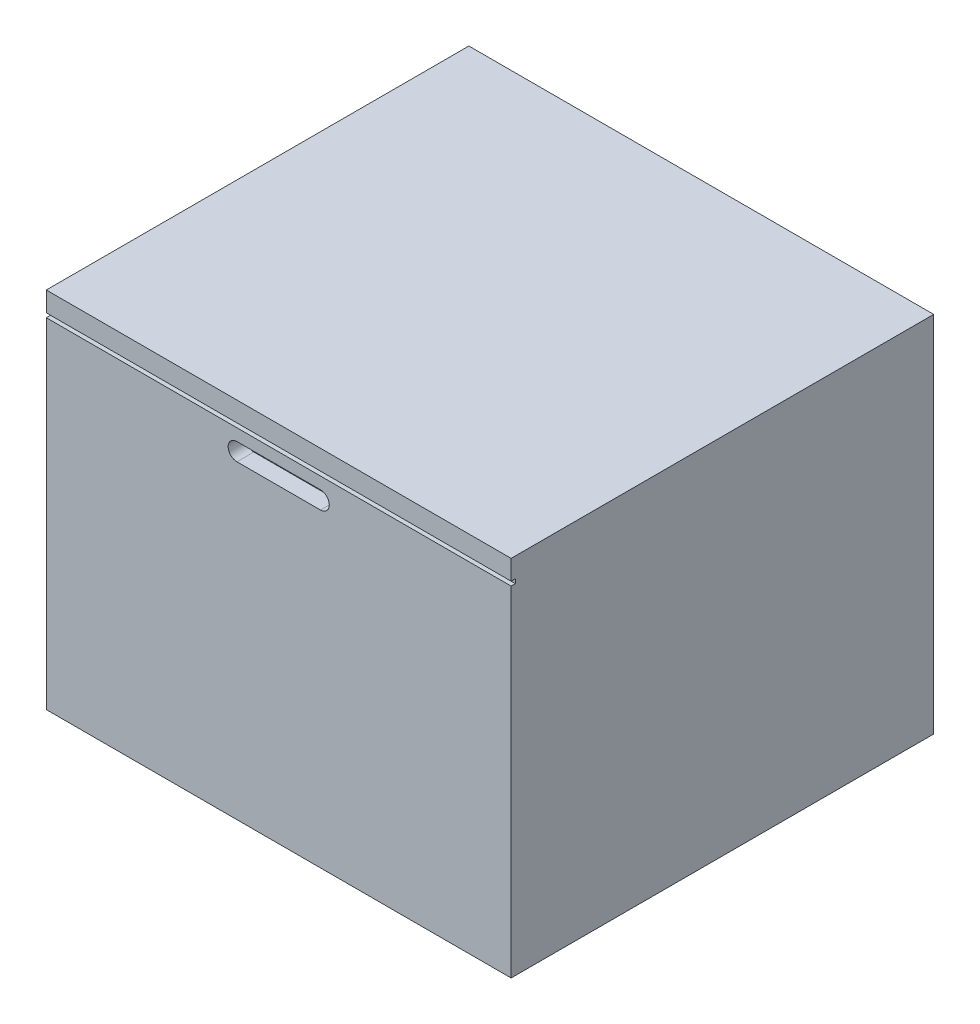
ISO-10303-21;
HEADER;
FILE_DESCRIPTION(('STEP AP214'),'2;1');
FILE_NAME('part.step','',(''),(''),'','','');
FILE_SCHEMA(('AUTOMOTIVE_DESIGN { 1 0 10303 214 1 1 1 1 }'));
ENDSEC;
DATA;
#1=APPLICATION_CONTEXT('core data for automotive mechanical design processes');
#2=APPLICATION_PROTOCOL_DEFINITION('international standard','automotive_design',2000,#1);
#3=PRODUCT_CONTEXT('',#1,'mechanical');
#4=PRODUCT('Part','Part','',(#3));
#5=PRODUCT_RELATED_PRODUCT_CATEGORY('part','',(#4));
#6=PRODUCT_DEFINITION_FORMATION('','',#4);
#7=PRODUCT_DEFINITION_CONTEXT('part definition',#1,'design');
#8=PRODUCT_DEFINITION('design','',#6,#7);
#9=PRODUCT_DEFINITION_SHAPE('','',#8);
#10=(LENGTH_UNIT() NAMED_UNIT(*) SI_UNIT(.MILLI.,.METRE.));
#11=(NAMED_UNIT(*) PLANE_ANGLE_UNIT() SI_UNIT($,.RADIAN.));
#12=(NAMED_UNIT(*) SI_UNIT($,.STERADIAN.) SOLID_ANGLE_UNIT());
#13=UNCERTAINTY_MEASURE_WITH_UNIT(LENGTH_MEASURE(1.E-05),#10,'distance_accuracy_value','');
#14=(GEOMETRIC_REPRESENTATION_CONTEXT(3) GLOBAL_UNCERTAINTY_ASSIGNED_CONTEXT((#13)) GLOBAL_UNIT_ASSIGNED_CONTEXT((#10,
#11,#12)) REPRESENTATION_CONTEXT('',''));
#15=CARTESIAN_POINT('',(0.,0.,0.));
#16=DIRECTION('',(0.,0.,1.));
#17=DIRECTION('',(1.,0.,0.));
#18=AXIS2_PLACEMENT_3D('',#15,#16,#17);
#19=CARTESIAN_POINT('',(-275.,430.,250.));
#20=DIRECTION('',(0.,0.,-1.));
#21=DIRECTION('',(-1.,0.,0.));
#22=AXIS2_PLACEMENT_3D('',#19,#20,#21);
#23=PLANE('',#22);
#24=DIRECTION('',(0.,-1.,0.));
#25=VECTOR('',#24,1.);
#26=CARTESIAN_POINT('',(-275.,430.,250.));
#27=LINE('',#26,#25);
#28=CARTESIAN_POINT('',(-275.,430.,250.));
#29=VERTEX_POINT('',#28);
#30=CARTESIAN_POINT('',(-275.,406.590827498073,250.));
#31=VERTEX_POINT('',#30);
#32=EDGE_CURVE('E236',#29,#31,#27,.T.);
#33=ORIENTED_EDGE('',*,*,#32,.T.);
#34=DIRECTION('',(-1.,0.,0.));
#35=VECTOR('',#34,1.);
#36=CARTESIAN_POINT('',(-275.,406.590827498073,250.));
#37=LINE('',#36,#35);
#38=CARTESIAN_POINT('',(275.,406.590827498073,250.));
#39=VERTEX_POINT('',#38);
#40=EDGE_CURVE('E146',#39,#31,#37,.T.);
#41=ORIENTED_EDGE('',*,*,#40,.F.);
#42=DIRECTION('',(0.,-1.,0.));
#43=VECTOR('',#42,1.);
#44=CARTESIAN_POINT('',(275.,430.,250.));
#45=LINE('',#44,#43);
#46=CARTESIAN_POINT('',(275.,430.,250.));
#47=VERTEX_POINT('',#46);
#48=EDGE_CURVE('E232',#47,#39,#45,.T.);
#49=ORIENTED_EDGE('',*,*,#48,.F.);
#50=DIRECTION('',(1.,0.,0.));
#51=VECTOR('',#50,1.);
#52=CARTESIAN_POINT('',(-275.,430.,250.));
#53=LINE('',#52,#51);
#54=EDGE_CURVE('E216',#29,#47,#53,.T.);
#55=ORIENTED_EDGE('',*,*,#54,.F.);
#56=EDGE_LOOP('',(#33,#41,#49,#55));
#57=FACE_BOUND('',#56,.T.);
#58=ADVANCED_FACE('F39',(#57),#23,.F.);
#59=CARTESIAN_POINT('',(275.,430.,-250.));
#60=DIRECTION('',(-1.,0.,0.));
#61=DIRECTION('',(0.,0.,1.));
#62=AXIS2_PLACEMENT_3D('',#59,#60,#61);
#63=PLANE('',#62);
#64=ORIENTED_EDGE('',*,*,#48,.T.);
#65=DIRECTION('',(0.,0.,1.));
#66=VECTOR('',#65,1.);
#67=CARTESIAN_POINT('',(275.,406.590827498073,245.));
#68=LINE('',#67,#66);
#69=CARTESIAN_POINT('',(275.,406.590827498073,245.));
#70=VERTEX_POINT('',#69);
#71=EDGE_CURVE('E156',#70,#39,#68,.T.);
#72=ORIENTED_EDGE('',*,*,#71,.F.);
#73=DIRECTION('',(0.,1.,0.));
#74=VECTOR('',#73,1.);
#75=CARTESIAN_POINT('',(275.,406.590827498073,245.));
#76=LINE('',#75,#74);
#77=CARTESIAN_POINT('',(275.,401.590827498073,245.));
#78=VERTEX_POINT('',#77);
#79=EDGE_CURVE('E135',#78,#70,#76,.T.);
#80=ORIENTED_EDGE('',*,*,#79,.F.);
#81=DIRECTION('',(0.,0.,1.));
#82=VECTOR('',#81,1.);
#83=CARTESIAN_POINT('',(275.,401.590827498073,245.));
#84=LINE('',#83,#82);
#85=CARTESIAN_POINT('',(275.,401.590827498073,250.));
#86=VERTEX_POINT('',#85);
#87=EDGE_CURVE('E131',#78,#86,#84,.T.);
#88=ORIENTED_EDGE('',*,*,#87,.T.);
#89=CARTESIAN_POINT('',(275.,0.,250.));
#90=VERTEX_POINT('',#89);
#91=EDGE_CURVE('E219',#86,#90,#45,.T.);
#92=ORIENTED_EDGE('',*,*,#91,.T.);
#93=DIRECTION('',(0.,0.,-1.));
#94=VECTOR('',#93,1.);
#95=CARTESIAN_POINT('',(275.,0.,-250.));
#96=LINE('',#95,#94);
#97=CARTESIAN_POINT('',(275.,0.,-250.));
#98=VERTEX_POINT('',#97);
#99=EDGE_CURVE('E196',#90,#98,#96,.T.);
#100=ORIENTED_EDGE('',*,*,#99,.T.);
#101=DIRECTION('',(0.,-1.,0.));
#102=VECTOR('',#101,1.);
#103=CARTESIAN_POINT('',(275.,430.,-250.));
#104=LINE('',#103,#102);
#105=CARTESIAN_POINT('',(275.,430.,-250.));
#106=VERTEX_POINT('',#105);
#107=EDGE_CURVE('E11',#106,#98,#104,.T.);
#108=ORIENTED_EDGE('',*,*,#107,.F.);
#109=DIRECTION('',(0.,0.,-1.));
#110=VECTOR('',#109,1.);
#111=CARTESIAN_POINT('',(275.,430.,-250.));
#112=LINE('',#111,#110);
#113=EDGE_CURVE('E205',#47,#106,#112,.T.);
#114=ORIENTED_EDGE('',*,*,#113,.F.);
#115=EDGE_LOOP('',(#64,#72,#80,#88,#92,#100,#108,#114));
#116=FACE_BOUND('',#115,.T.);
#117=ADVANCED_FACE('F41',(#116),#63,.F.);
#118=CARTESIAN_POINT('',(-275.,430.,-250.));
#119=DIRECTION('',(0.,0.,1.));
#120=DIRECTION('',(1.,0.,0.));
#121=AXIS2_PLACEMENT_3D('',#118,#119,#120);
#122=PLANE('',#121);
#123=DIRECTION('',(-1.,0.,0.));
#124=VECTOR('',#123,1.);
#125=CARTESIAN_POINT('',(-275.,0.,-250.));
#126=LINE('',#125,#124);
#127=CARTESIAN_POINT('',(-275.,0.,-250.));
#128=VERTEX_POINT('',#127);
#129=EDGE_CURVE('E223',#98,#128,#126,.T.);
#130=ORIENTED_EDGE('',*,*,#129,.T.);
#131=DIRECTION('',(0.,-1.,0.));
#132=VECTOR('',#131,1.);
#133=CARTESIAN_POINT('',(-275.,430.,-250.));
#134=LINE('',#133,#132);
#135=CARTESIAN_POINT('',(-275.,430.,-250.));
#136=VERTEX_POINT('',#135);
#137=EDGE_CURVE('E48',#136,#128,#134,.T.);
#138=ORIENTED_EDGE('',*,*,#137,.F.);
#139=DIRECTION('',(-1.,0.,0.));
#140=VECTOR('',#139,1.);
#141=CARTESIAN_POINT('',(-275.,430.,-250.));
#142=LINE('',#141,#140);
#143=EDGE_CURVE('E209',#106,#136,#142,.T.);
#144=ORIENTED_EDGE('',*,*,#143,.F.);
#145=ORIENTED_EDGE('',*,*,#107,.T.);
#146=EDGE_LOOP('',(#130,#138,#144,#145));
#147=FACE_BOUND('',#146,.T.);
#148=ADVANCED_FACE('F277',(#147),#122,.F.);
#149=CARTESIAN_POINT('',(-275.,430.,-250.));
#150=DIRECTION('',(1.,0.,0.));
#151=DIRECTION('',(0.,0.,-1.));
#152=AXIS2_PLACEMENT_3D('',#149,#150,#151);
#153=PLANE('',#152);
#154=DIRECTION('',(0.,-1.,0.));
#155=VECTOR('',#154,1.);
#156=CARTESIAN_POINT('',(-275.,406.590827498073,245.));
#157=LINE('',#156,#155);
#158=CARTESIAN_POINT('',(-275.,406.590827498073,245.));
#159=VERTEX_POINT('',#158);
#160=CARTESIAN_POINT('',(-275.,401.590827498073,245.));
#161=VERTEX_POINT('',#160);
#162=EDGE_CURVE('E136',#159,#161,#157,.T.);
#163=ORIENTED_EDGE('',*,*,#162,.F.);
#164=DIRECTION('',(0.,0.,1.));
#165=VECTOR('',#164,1.);
#166=CARTESIAN_POINT('',(-275.,406.590827498073,245.));
#167=LINE('',#166,#165);
#168=EDGE_CURVE('E182',#159,#31,#167,.T.);
#169=ORIENTED_EDGE('',*,*,#168,.T.);
#170=ORIENTED_EDGE('',*,*,#32,.F.);
#171=DIRECTION('',(0.,0.,1.));
#172=VECTOR('',#171,1.);
#173=CARTESIAN_POINT('',(-275.,430.,-250.));
#174=LINE('',#173,#172);
#175=EDGE_CURVE('E213',#136,#29,#174,.T.);
#176=ORIENTED_EDGE('',*,*,#175,.F.);
#177=ORIENTED_EDGE('',*,*,#137,.T.);
#178=DIRECTION('',(0.,0.,1.));
#179=VECTOR('',#178,1.);
#180=CARTESIAN_POINT('',(-275.,0.,-250.));
#181=LINE('',#180,#179);
#182=CARTESIAN_POINT('',(-275.,0.,250.));
#183=VERTEX_POINT('',#182);
#184=EDGE_CURVE('E226',#128,#183,#181,.T.);
#185=ORIENTED_EDGE('',*,*,#184,.T.);
#186=CARTESIAN_POINT('',(-275.,401.590827498073,250.));
#187=VERTEX_POINT('',#186);
#188=EDGE_CURVE('E151',#187,#183,#27,.T.);
#189=ORIENTED_EDGE('',*,*,#188,.F.);
#190=DIRECTION('',(0.,0.,1.));
#191=VECTOR('',#190,1.);
#192=CARTESIAN_POINT('',(-275.,401.590827498073,245.));
#193=LINE('',#192,#191);
#194=EDGE_CURVE('E55',#161,#187,#193,.T.);
#195=ORIENTED_EDGE('',*,*,#194,.F.);
#196=EDGE_LOOP('',(#163,#169,#170,#176,#177,#185,#189,#195));
#197=FACE_BOUND('',#196,.T.);
#198=ADVANCED_FACE('F149',(#197),#153,.F.);
#199=DIRECTION('',(1.,0.,0.));
#200=VECTOR('',#199,1.);
#201=CARTESIAN_POINT('',(-49.4488420322469,366.735136980563,250.));
#202=LINE('',#201,#200);
#203=CARTESIAN_POINT('',(-49.448842032247,366.735136980563,250.));
#204=VERTEX_POINT('',#203);
#205=CARTESIAN_POINT('',(49.4488420322468,366.735136980563,250.));
#206=VERTEX_POINT('',#205);
#207=EDGE_CURVE('E181',#204,#206,#202,.T.);
#208=ORIENTED_EDGE('',*,*,#207,.F.);
#209=CARTESIAN_POINT('',(-49.4488420322469,377.106092769651,250.));
#210=DIRECTION('',(0.,0.,1.));
#211=DIRECTION('',(1.,0.,0.));
#212=AXIS2_PLACEMENT_3D('',#209,#210,#211);
#213=CIRCLE('',#212,10.3709557890885);
#214=CARTESIAN_POINT('',(-49.4488420322469,387.47704855874,250.));
#215=VERTEX_POINT('',#214);
#216=EDGE_CURVE('E63',#215,#204,#213,.T.);
#217=ORIENTED_EDGE('',*,*,#216,.F.);
#218=DIRECTION('',(-1.,0.,0.));
#219=VECTOR('',#218,1.);
#220=CARTESIAN_POINT('',(-49.4488420322469,387.47704855874,250.));
#221=LINE('',#220,#219);
#222=CARTESIAN_POINT('',(49.4488420322468,387.47704855874,250.));
#223=VERTEX_POINT('',#222);
#224=EDGE_CURVE('E166',#223,#215,#221,.T.);
#225=ORIENTED_EDGE('',*,*,#224,.F.);
#226=CARTESIAN_POINT('',(49.4488420322468,377.106092769651,250.));
#227=DIRECTION('',(0.,0.,1.));
#228=DIRECTION('',(1.,0.,0.));
#229=AXIS2_PLACEMENT_3D('',#226,#227,#228);
#230=CIRCLE('',#229,10.3709557890885);
#231=EDGE_CURVE('E186',#206,#223,#230,.T.);
#232=ORIENTED_EDGE('',*,*,#231,.F.);
#233=EDGE_LOOP('',(#208,#217,#225,#232));
#234=FACE_BOUND('',#233,.T.);
#235=ORIENTED_EDGE('',*,*,#91,.F.);
#236=DIRECTION('',(1.,0.,0.));
#237=VECTOR('',#236,1.);
#238=CARTESIAN_POINT('',(-275.,401.590827498073,250.));
#239=LINE('',#238,#237);
#240=EDGE_CURVE('E253',#187,#86,#239,.T.);
#241=ORIENTED_EDGE('',*,*,#240,.F.);
#242=ORIENTED_EDGE('',*,*,#188,.T.);
#243=DIRECTION('',(1.,0.,0.));
#244=VECTOR('',#243,1.);
#245=CARTESIAN_POINT('',(-275.,0.,250.));
#246=LINE('',#245,#244);
#247=EDGE_CURVE('E210',#183,#90,#246,.T.);
#248=ORIENTED_EDGE('',*,*,#247,.T.);
#249=EDGE_LOOP('',(#235,#241,#242,#248));
#250=FACE_BOUND('',#249,.T.);
#251=ADVANCED_FACE('F252',(#234,#250),#23,.F.);
#252=CARTESIAN_POINT('',(0.,430.,0.));
#253=DIRECTION('',(0.,1.,0.));
#254=DIRECTION('',(0.,0.,1.));
#255=AXIS2_PLACEMENT_3D('',#252,#253,#254);
#256=PLANE('',#255);
#257=ORIENTED_EDGE('',*,*,#113,.T.);
#258=ORIENTED_EDGE('',*,*,#143,.T.);
#259=ORIENTED_EDGE('',*,*,#175,.T.);
#260=ORIENTED_EDGE('',*,*,#54,.T.);
#261=EDGE_LOOP('',(#257,#258,#259,#260));
#262=FACE_BOUND('',#261,.T.);
#263=ADVANCED_FACE('F276',(#262),#256,.T.);
#264=CARTESIAN_POINT('',(0.,0.,0.));
#265=DIRECTION('',(0.,1.,0.));
#266=DIRECTION('',(0.,0.,1.));
#267=AXIS2_PLACEMENT_3D('',#264,#265,#266);
#268=PLANE('',#267);
#269=ORIENTED_EDGE('',*,*,#99,.F.);
#270=ORIENTED_EDGE('',*,*,#247,.F.);
#271=ORIENTED_EDGE('',*,*,#184,.F.);
#272=ORIENTED_EDGE('',*,*,#129,.F.);
#273=EDGE_LOOP('',(#269,#270,#271,#272));
#274=FACE_BOUND('',#273,.T.);
#275=ADVANCED_FACE('F249',(#274),#268,.F.);
#276=CARTESIAN_POINT('',(-49.4488420322469,377.106092769651,230.));
#277=DIRECTION('',(0.,0.,1.));
#278=DIRECTION('',(1.,0.,0.));
#279=AXIS2_PLACEMENT_3D('',#276,#277,#278);
#280=CYLINDRICAL_SURFACE('',#279,10.3709557890885);
#281=ORIENTED_EDGE('',*,*,#216,.T.);
#282=DIRECTION('',(0.,0.,1.));
#283=VECTOR('',#282,1.);
#284=CARTESIAN_POINT('',(-49.4488420322469,366.735136980563,230.));
#285=LINE('',#284,#283);
#286=CARTESIAN_POINT('',(-49.4488420322469,366.735136980563,230.));
#287=VERTEX_POINT('',#286);
#288=EDGE_CURVE('E178',#287,#204,#285,.T.);
#289=ORIENTED_EDGE('',*,*,#288,.F.);
#290=CARTESIAN_POINT('',(-49.4488420322469,377.106092769651,230.));
#291=DIRECTION('',(0.,0.,1.));
#292=DIRECTION('',(1.,0.,0.));
#293=AXIS2_PLACEMENT_3D('',#290,#291,#292);
#294=CIRCLE('',#293,10.3709557890885);
#295=CARTESIAN_POINT('',(-49.4488420322469,387.47704855874,230.));
#296=VERTEX_POINT('',#295);
#297=EDGE_CURVE('E161',#296,#287,#294,.T.);
#298=ORIENTED_EDGE('',*,*,#297,.F.);
#299=DIRECTION('',(0.,0.,1.));
#300=VECTOR('',#299,1.);
#301=CARTESIAN_POINT('',(-49.4488420322469,387.47704855874,230.));
#302=LINE('',#301,#300);
#303=EDGE_CURVE('E193',#296,#215,#302,.T.);
#304=ORIENTED_EDGE('',*,*,#303,.T.);
#305=EDGE_LOOP('',(#281,#289,#298,#304));
#306=FACE_BOUND('',#305,.T.);
#307=ADVANCED_FACE('F303',(#306),#280,.F.);
#308=CARTESIAN_POINT('',(-49.4488420322469,387.47704855874,230.));
#309=DIRECTION('',(0.,1.,0.));
#310=DIRECTION('',(0.,0.,1.));
#311=AXIS2_PLACEMENT_3D('',#308,#309,#310);
#312=PLANE('',#311);
#313=ORIENTED_EDGE('',*,*,#224,.T.);
#314=ORIENTED_EDGE('',*,*,#303,.F.);
#315=DIRECTION('',(-1.,0.,0.));
#316=VECTOR('',#315,1.);
#317=CARTESIAN_POINT('',(-49.4488420322469,387.47704855874,230.));
#318=LINE('',#317,#316);
#319=CARTESIAN_POINT('',(49.4488420322468,387.47704855874,230.));
#320=VERTEX_POINT('',#319);
#321=EDGE_CURVE('E174',#320,#296,#318,.T.);
#322=ORIENTED_EDGE('',*,*,#321,.F.);
#323=DIRECTION('',(0.,0.,1.));
#324=VECTOR('',#323,1.);
#325=CARTESIAN_POINT('',(49.4488420322468,387.47704855874,230.));
#326=LINE('',#325,#324);
#327=EDGE_CURVE('E197',#320,#223,#326,.T.);
#328=ORIENTED_EDGE('',*,*,#327,.T.);
#329=EDGE_LOOP('',(#313,#314,#322,#328));
#330=FACE_BOUND('',#329,.T.);
#331=ADVANCED_FACE('F308',(#330),#312,.F.);
#332=CARTESIAN_POINT('',(49.4488420322468,377.106092769651,230.));
#333=DIRECTION('',(0.,0.,1.));
#334=DIRECTION('',(1.,0.,0.));
#335=AXIS2_PLACEMENT_3D('',#332,#333,#334);
#336=CYLINDRICAL_SURFACE('',#335,10.3709557890885);
#337=ORIENTED_EDGE('',*,*,#231,.T.);
#338=ORIENTED_EDGE('',*,*,#327,.F.);
#339=CARTESIAN_POINT('',(49.4488420322468,377.106092769651,230.));
#340=DIRECTION('',(0.,0.,1.));
#341=DIRECTION('',(1.,0.,0.));
#342=AXIS2_PLACEMENT_3D('',#339,#340,#341);
#343=CIRCLE('',#342,10.3709557890885);
#344=CARTESIAN_POINT('',(49.4488420322468,366.735136980563,230.));
#345=VERTEX_POINT('',#344);
#346=EDGE_CURVE('E170',#345,#320,#343,.T.);
#347=ORIENTED_EDGE('',*,*,#346,.F.);
#348=DIRECTION('',(0.,0.,1.));
#349=VECTOR('',#348,1.);
#350=CARTESIAN_POINT('',(49.4488420322468,366.735136980563,230.));
#351=LINE('',#350,#349);
#352=EDGE_CURVE('E200',#345,#206,#351,.T.);
#353=ORIENTED_EDGE('',*,*,#352,.T.);
#354=EDGE_LOOP('',(#337,#338,#347,#353));
#355=FACE_BOUND('',#354,.T.);
#356=ADVANCED_FACE('F310',(#355),#336,.F.);
#357=CARTESIAN_POINT('',(-49.4488420322469,366.735136980563,230.));
#358=DIRECTION('',(0.,-1.,0.));
#359=DIRECTION('',(0.,0.,-1.));
#360=AXIS2_PLACEMENT_3D('',#357,#358,#359);
#361=PLANE('',#360);
#362=ORIENTED_EDGE('',*,*,#207,.T.);
#363=ORIENTED_EDGE('',*,*,#352,.F.);
#364=DIRECTION('',(1.,0.,0.));
#365=VECTOR('',#364,1.);
#366=CARTESIAN_POINT('',(-49.4488420322469,366.735136980563,230.));
#367=LINE('',#366,#365);
#368=EDGE_CURVE('E165',#287,#345,#367,.T.);
#369=ORIENTED_EDGE('',*,*,#368,.F.);
#370=ORIENTED_EDGE('',*,*,#288,.T.);
#371=EDGE_LOOP('',(#362,#363,#369,#370));
#372=FACE_BOUND('',#371,.T.);
#373=ADVANCED_FACE('F299',(#372),#361,.F.);
#374=CARTESIAN_POINT('',(-49.4488420322469,377.106092769651,230.));
#375=DIRECTION('',(0.,0.,1.));
#376=DIRECTION('',(1.,0.,0.));
#377=AXIS2_PLACEMENT_3D('',#374,#375,#376);
#378=PLANE('',#377);
#379=ORIENTED_EDGE('',*,*,#297,.T.);
#380=ORIENTED_EDGE('',*,*,#368,.T.);
#381=ORIENTED_EDGE('',*,*,#346,.T.);
#382=ORIENTED_EDGE('',*,*,#321,.T.);
#383=EDGE_LOOP('',(#379,#380,#381,#382));
#384=FACE_BOUND('',#383,.T.);
#385=ADVANCED_FACE('F306',(#384),#378,.T.);
#386=CARTESIAN_POINT('',(-275.,406.590827498073,245.));
#387=DIRECTION('',(0.,1.,0.));
#388=DIRECTION('',(0.,0.,1.));
#389=AXIS2_PLACEMENT_3D('',#386,#387,#388);
#390=PLANE('',#389);
#391=ORIENTED_EDGE('',*,*,#40,.T.);
#392=ORIENTED_EDGE('',*,*,#168,.F.);
#393=DIRECTION('',(-1.,0.,0.));
#394=VECTOR('',#393,1.);
#395=CARTESIAN_POINT('',(-275.,406.590827498073,245.));
#396=LINE('',#395,#394);
#397=EDGE_CURVE('E142',#70,#159,#396,.T.);
#398=ORIENTED_EDGE('',*,*,#397,.F.);
#399=ORIENTED_EDGE('',*,*,#71,.T.);
#400=EDGE_LOOP('',(#391,#392,#398,#399));
#401=FACE_BOUND('',#400,.T.);
#402=ADVANCED_FACE('F269',(#401),#390,.F.);
#403=CARTESIAN_POINT('',(-275.,401.590827498073,245.));
#404=DIRECTION('',(0.,-1.,0.));
#405=DIRECTION('',(0.,0.,-1.));
#406=AXIS2_PLACEMENT_3D('',#403,#404,#405);
#407=PLANE('',#406);
#408=ORIENTED_EDGE('',*,*,#240,.T.);
#409=ORIENTED_EDGE('',*,*,#87,.F.);
#410=DIRECTION('',(1.,0.,0.));
#411=VECTOR('',#410,1.);
#412=CARTESIAN_POINT('',(-275.,401.590827498073,245.));
#413=LINE('',#412,#411);
#414=EDGE_CURVE('E127',#161,#78,#413,.T.);
#415=ORIENTED_EDGE('',*,*,#414,.F.);
#416=ORIENTED_EDGE('',*,*,#194,.T.);
#417=EDGE_LOOP('',(#408,#409,#415,#416));
#418=FACE_BOUND('',#417,.T.);
#419=ADVANCED_FACE('F129',(#418),#407,.F.);
#420=CARTESIAN_POINT('',(0.,0.,245.));
#421=DIRECTION('',(0.,0.,1.));
#422=DIRECTION('',(1.,0.,0.));
#423=AXIS2_PLACEMENT_3D('',#420,#421,#422);
#424=PLANE('',#423);
#425=ORIENTED_EDGE('',*,*,#162,.T.);
#426=ORIENTED_EDGE('',*,*,#414,.T.);
#427=ORIENTED_EDGE('',*,*,#79,.T.);
#428=ORIENTED_EDGE('',*,*,#397,.T.);
#429=EDGE_LOOP('',(#425,#426,#427,#428));
#430=FACE_BOUND('',#429,.T.);
#431=ADVANCED_FACE('F140',(#430),#424,.T.);
#432=CLOSED_SHELL('',(#58,#117,#148,#198,#251,#263,#275,#307,#331,#356,#373,#385,#402,#419,#431));
#433=MANIFOLD_SOLID_BREP('B2',#432);
#434=ADVANCED_BREP_SHAPE_REPRESENTATION('',(#18,#433),#14);
#435=SHAPE_DEFINITION_REPRESENTATION(#9,#434);
ENDSEC;
END-ISO-10303-21;
